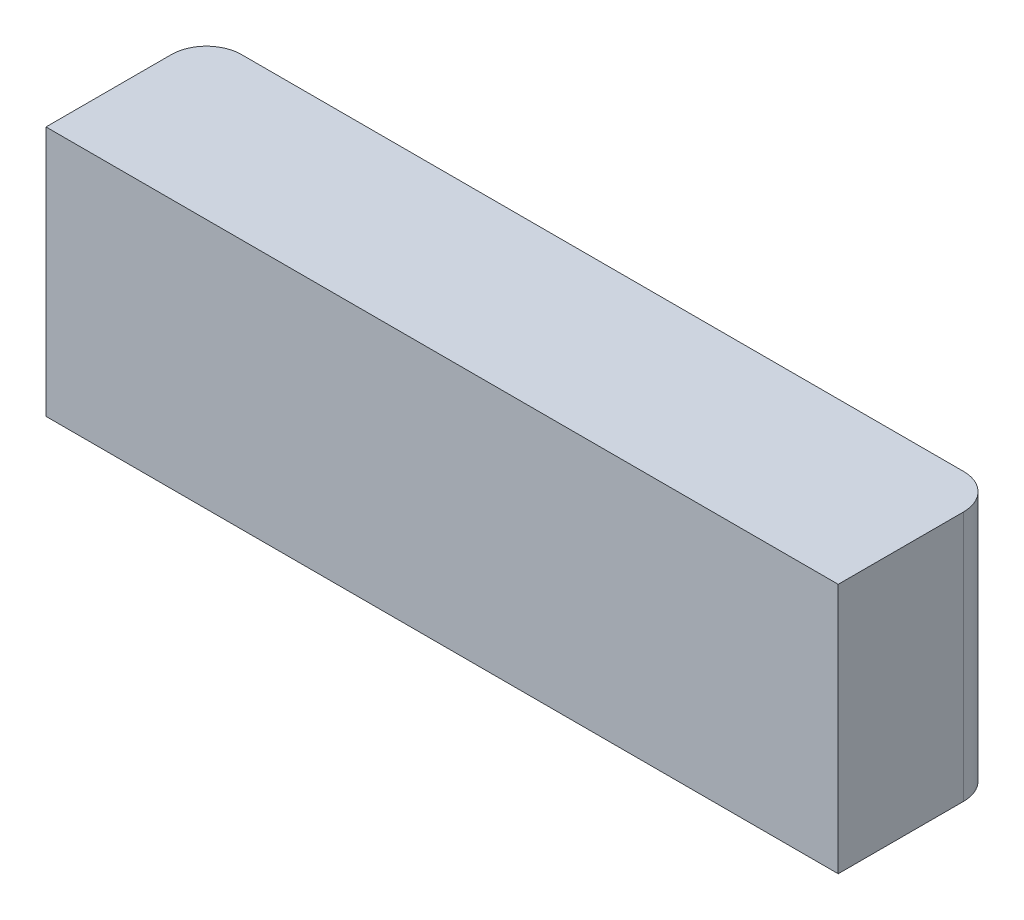
ISO-10303-21;
HEADER;
FILE_DESCRIPTION(('STEP AP214'),'2;1');
FILE_NAME('part.step','',(''),(''),'','','');
FILE_SCHEMA(('AUTOMOTIVE_DESIGN { 1 0 10303 214 1 1 1 1 }'));
ENDSEC;
DATA;
#1=APPLICATION_CONTEXT('core data for automotive mechanical design processes');
#2=APPLICATION_PROTOCOL_DEFINITION('international standard','automotive_design',2000,#1);
#3=PRODUCT_CONTEXT('',#1,'mechanical');
#4=PRODUCT('Part','Part','',(#3));
#5=PRODUCT_RELATED_PRODUCT_CATEGORY('part','',(#4));
#6=PRODUCT_DEFINITION_FORMATION('','',#4);
#7=PRODUCT_DEFINITION_CONTEXT('part definition',#1,'design');
#8=PRODUCT_DEFINITION('design','',#6,#7);
#9=PRODUCT_DEFINITION_SHAPE('','',#8);
#10=(LENGTH_UNIT() NAMED_UNIT(*) SI_UNIT(.MILLI.,.METRE.));
#11=(NAMED_UNIT(*) PLANE_ANGLE_UNIT() SI_UNIT($,.RADIAN.));
#12=(NAMED_UNIT(*) SI_UNIT($,.STERADIAN.) SOLID_ANGLE_UNIT());
#13=UNCERTAINTY_MEASURE_WITH_UNIT(LENGTH_MEASURE(1.E-05),#10,'distance_accuracy_value','');
#14=(GEOMETRIC_REPRESENTATION_CONTEXT(3) GLOBAL_UNCERTAINTY_ASSIGNED_CONTEXT((#13)) GLOBAL_UNIT_ASSIGNED_CONTEXT((#10,
#11,#12)) REPRESENTATION_CONTEXT('',''));
#15=CARTESIAN_POINT('',(0.,0.,0.));
#16=DIRECTION('',(0.,0.,1.));
#17=DIRECTION('',(1.,0.,0.));
#18=AXIS2_PLACEMENT_3D('',#15,#16,#17);
#19=CARTESIAN_POINT('',(118.5,37.5,-13.4999999999999));
#20=DIRECTION('',(-1.,0.,0.));
#21=DIRECTION('',(0.,0.,1.));
#22=AXIS2_PLACEMENT_3D('',#19,#20,#21);
#23=PLANE('',#22);
#24=DIRECTION('',(0.,0.,-1.));
#25=VECTOR('',#24,1.);
#26=CARTESIAN_POINT('',(118.5,-37.5,-13.4999999999999));
#27=LINE('',#26,#25);
#28=CARTESIAN_POINT('',(118.5,-37.5,24.));
#29=VERTEX_POINT('',#28);
#30=CARTESIAN_POINT('',(118.5,-37.5,-13.4999999999999));
#31=VERTEX_POINT('',#30);
#32=EDGE_CURVE('E127',#29,#31,#27,.T.);
#33=ORIENTED_EDGE('',*,*,#32,.T.);
#34=DIRECTION('',(0.,-1.,0.));
#35=VECTOR('',#34,1.);
#36=CARTESIAN_POINT('',(118.5,37.5,-13.4999999999999));
#37=LINE('',#36,#35);
#38=CARTESIAN_POINT('',(118.5,37.5,-13.4999999999999));
#39=VERTEX_POINT('',#38);
#40=EDGE_CURVE('E11',#39,#31,#37,.T.);
#41=ORIENTED_EDGE('',*,*,#40,.F.);
#42=DIRECTION('',(0.,0.,-1.));
#43=VECTOR('',#42,1.);
#44=CARTESIAN_POINT('',(118.5,37.5,-13.4999999999999));
#45=LINE('',#44,#43);
#46=CARTESIAN_POINT('',(118.5,37.5,24.));
#47=VERTEX_POINT('',#46);
#48=EDGE_CURVE('E137',#47,#39,#45,.T.);
#49=ORIENTED_EDGE('',*,*,#48,.F.);
#50=DIRECTION('',(0.,-1.,0.));
#51=VECTOR('',#50,1.);
#52=CARTESIAN_POINT('',(118.5,37.5,24.));
#53=LINE('',#52,#51);
#54=EDGE_CURVE('E123',#47,#29,#53,.T.);
#55=ORIENTED_EDGE('',*,*,#54,.T.);
#56=EDGE_LOOP('',(#33,#41,#49,#55));
#57=FACE_BOUND('',#56,.T.);
#58=ADVANCED_FACE('F43',(#57),#23,.F.);
#59=CARTESIAN_POINT('',(108.,37.5,-13.5));
#60=DIRECTION('',(0.,-1.,0.));
#61=DIRECTION('',(0.,0.,-1.));
#62=AXIS2_PLACEMENT_3D('',#59,#60,#61);
#63=CYLINDRICAL_SURFACE('',#62,10.5);
#64=CARTESIAN_POINT('',(108.,-37.5,-13.5));
#65=DIRECTION('',(0.,1.,0.));
#66=DIRECTION('',(0.,0.,1.));
#67=AXIS2_PLACEMENT_3D('',#64,#65,#66);
#68=CIRCLE('',#67,10.5);
#69=CARTESIAN_POINT('',(108.,-37.5,-24.));
#70=VERTEX_POINT('',#69);
#71=EDGE_CURVE('E130',#31,#70,#68,.T.);
#72=ORIENTED_EDGE('',*,*,#71,.T.);
#73=DIRECTION('',(0.,-1.,0.));
#74=VECTOR('',#73,1.);
#75=CARTESIAN_POINT('',(108.,37.5,-24.));
#76=LINE('',#75,#74);
#77=CARTESIAN_POINT('',(108.,37.5,-24.));
#78=VERTEX_POINT('',#77);
#79=EDGE_CURVE('E51',#78,#70,#76,.T.);
#80=ORIENTED_EDGE('',*,*,#79,.F.);
#81=CARTESIAN_POINT('',(108.,37.5,-13.5));
#82=DIRECTION('',(0.,1.,0.));
#83=DIRECTION('',(0.,0.,1.));
#84=AXIS2_PLACEMENT_3D('',#81,#82,#83);
#85=CIRCLE('',#84,10.5);
#86=EDGE_CURVE('E96',#39,#78,#85,.T.);
#87=ORIENTED_EDGE('',*,*,#86,.F.);
#88=ORIENTED_EDGE('',*,*,#40,.T.);
#89=EDGE_LOOP('',(#72,#80,#87,#88));
#90=FACE_BOUND('',#89,.T.);
#91=ADVANCED_FACE('F161',(#90),#63,.T.);
#92=CARTESIAN_POINT('',(-108.,37.5,-24.));
#93=DIRECTION('',(0.,0.,1.));
#94=DIRECTION('',(1.,0.,0.));
#95=AXIS2_PLACEMENT_3D('',#92,#93,#94);
#96=PLANE('',#95);
#97=DIRECTION('',(-1.,0.,0.));
#98=VECTOR('',#97,1.);
#99=CARTESIAN_POINT('',(-108.,-37.5,-24.));
#100=LINE('',#99,#98);
#101=CARTESIAN_POINT('',(-108.,-37.5,-24.));
#102=VERTEX_POINT('',#101);
#103=EDGE_CURVE('E132',#70,#102,#100,.T.);
#104=ORIENTED_EDGE('',*,*,#103,.T.);
#105=DIRECTION('',(0.,-1.,0.));
#106=VECTOR('',#105,1.);
#107=CARTESIAN_POINT('',(-108.,37.5,-24.));
#108=LINE('',#107,#106);
#109=CARTESIAN_POINT('',(-108.,37.5,-24.));
#110=VERTEX_POINT('',#109);
#111=EDGE_CURVE('E118',#110,#102,#108,.T.);
#112=ORIENTED_EDGE('',*,*,#111,.F.);
#113=DIRECTION('',(-1.,0.,0.));
#114=VECTOR('',#113,1.);
#115=CARTESIAN_POINT('',(-108.,37.5,-24.));
#116=LINE('',#115,#114);
#117=EDGE_CURVE('E109',#78,#110,#116,.T.);
#118=ORIENTED_EDGE('',*,*,#117,.F.);
#119=ORIENTED_EDGE('',*,*,#79,.T.);
#120=EDGE_LOOP('',(#104,#112,#118,#119));
#121=FACE_BOUND('',#120,.T.);
#122=ADVANCED_FACE('F143',(#121),#96,.F.);
#123=CARTESIAN_POINT('',(-108.,37.5,-13.5));
#124=DIRECTION('',(0.,-1.,0.));
#125=DIRECTION('',(0.,0.,-1.));
#126=AXIS2_PLACEMENT_3D('',#123,#124,#125);
#127=CYLINDRICAL_SURFACE('',#126,10.5);
#128=CARTESIAN_POINT('',(-108.,-37.5,-13.5));
#129=DIRECTION('',(0.,1.,0.));
#130=DIRECTION('',(0.,0.,1.));
#131=AXIS2_PLACEMENT_3D('',#128,#129,#130);
#132=CIRCLE('',#131,10.5);
#133=CARTESIAN_POINT('',(-118.5,-37.5,-13.4999999999999));
#134=VERTEX_POINT('',#133);
#135=EDGE_CURVE('E117',#102,#134,#132,.T.);
#136=ORIENTED_EDGE('',*,*,#135,.T.);
#137=DIRECTION('',(0.,-1.,0.));
#138=VECTOR('',#137,1.);
#139=CARTESIAN_POINT('',(-118.5,37.5,-13.4999999999999));
#140=LINE('',#139,#138);
#141=CARTESIAN_POINT('',(-118.5,37.5,-13.4999999999999));
#142=VERTEX_POINT('',#141);
#143=EDGE_CURVE('E114',#142,#134,#140,.T.);
#144=ORIENTED_EDGE('',*,*,#143,.F.);
#145=CARTESIAN_POINT('',(-108.,37.5,-13.5));
#146=DIRECTION('',(0.,1.,0.));
#147=DIRECTION('',(0.,0.,1.));
#148=AXIS2_PLACEMENT_3D('',#145,#146,#147);
#149=CIRCLE('',#148,10.5);
#150=EDGE_CURVE('E103',#110,#142,#149,.T.);
#151=ORIENTED_EDGE('',*,*,#150,.F.);
#152=ORIENTED_EDGE('',*,*,#111,.T.);
#153=EDGE_LOOP('',(#136,#144,#151,#152));
#154=FACE_BOUND('',#153,.T.);
#155=ADVANCED_FACE('F115',(#154),#127,.T.);
#156=CARTESIAN_POINT('',(-118.5,37.5,-13.4999999999999));
#157=DIRECTION('',(1.,0.,0.));
#158=DIRECTION('',(0.,0.,-1.));
#159=AXIS2_PLACEMENT_3D('',#156,#157,#158);
#160=PLANE('',#159);
#161=DIRECTION('',(0.,0.,1.));
#162=VECTOR('',#161,1.);
#163=CARTESIAN_POINT('',(-118.5,-37.5,-13.4999999999999));
#164=LINE('',#163,#162);
#165=CARTESIAN_POINT('',(-118.5,-37.5,24.));
#166=VERTEX_POINT('',#165);
#167=EDGE_CURVE('E82',#134,#166,#164,.T.);
#168=ORIENTED_EDGE('',*,*,#167,.T.);
#169=DIRECTION('',(0.,-1.,0.));
#170=VECTOR('',#169,1.);
#171=CARTESIAN_POINT('',(-118.5,37.5,24.));
#172=LINE('',#171,#170);
#173=CARTESIAN_POINT('',(-118.5,37.5,24.));
#174=VERTEX_POINT('',#173);
#175=EDGE_CURVE('E119',#174,#166,#172,.T.);
#176=ORIENTED_EDGE('',*,*,#175,.F.);
#177=DIRECTION('',(0.,0.,1.));
#178=VECTOR('',#177,1.);
#179=CARTESIAN_POINT('',(-118.5,37.5,-13.4999999999999));
#180=LINE('',#179,#178);
#181=EDGE_CURVE('E107',#142,#174,#180,.T.);
#182=ORIENTED_EDGE('',*,*,#181,.F.);
#183=ORIENTED_EDGE('',*,*,#143,.T.);
#184=EDGE_LOOP('',(#168,#176,#182,#183));
#185=FACE_BOUND('',#184,.T.);
#186=ADVANCED_FACE('F121',(#185),#160,.F.);
#187=CARTESIAN_POINT('',(-118.5,37.5,24.));
#188=DIRECTION('',(0.,0.,-1.));
#189=DIRECTION('',(-1.,0.,0.));
#190=AXIS2_PLACEMENT_3D('',#187,#188,#189);
#191=PLANE('',#190);
#192=DIRECTION('',(1.,0.,0.));
#193=VECTOR('',#192,1.);
#194=CARTESIAN_POINT('',(-118.5,-37.5,24.));
#195=LINE('',#194,#193);
#196=EDGE_CURVE('E88',#166,#29,#195,.T.);
#197=ORIENTED_EDGE('',*,*,#196,.T.);
#198=ORIENTED_EDGE('',*,*,#54,.F.);
#199=DIRECTION('',(1.,0.,0.));
#200=VECTOR('',#199,1.);
#201=CARTESIAN_POINT('',(-118.5,37.5,24.));
#202=LINE('',#201,#200);
#203=EDGE_CURVE('E59',#174,#47,#202,.T.);
#204=ORIENTED_EDGE('',*,*,#203,.F.);
#205=ORIENTED_EDGE('',*,*,#175,.T.);
#206=EDGE_LOOP('',(#197,#198,#204,#205));
#207=FACE_BOUND('',#206,.T.);
#208=ADVANCED_FACE('F150',(#207),#191,.F.);
#209=CARTESIAN_POINT('',(-108.,37.5,-13.5));
#210=DIRECTION('',(0.,1.,0.));
#211=DIRECTION('',(0.,0.,1.));
#212=AXIS2_PLACEMENT_3D('',#209,#210,#211);
#213=PLANE('',#212);
#214=ORIENTED_EDGE('',*,*,#48,.T.);
#215=ORIENTED_EDGE('',*,*,#86,.T.);
#216=ORIENTED_EDGE('',*,*,#117,.T.);
#217=ORIENTED_EDGE('',*,*,#150,.T.);
#218=ORIENTED_EDGE('',*,*,#181,.T.);
#219=ORIENTED_EDGE('',*,*,#203,.T.);
#220=EDGE_LOOP('',(#214,#215,#216,#217,#218,#219));
#221=FACE_BOUND('',#220,.T.);
#222=ADVANCED_FACE('F105',(#221),#213,.T.);
#223=CARTESIAN_POINT('',(-108.,-37.5,-13.5));
#224=DIRECTION('',(0.,1.,0.));
#225=DIRECTION('',(0.,0.,1.));
#226=AXIS2_PLACEMENT_3D('',#223,#224,#225);
#227=PLANE('',#226);
#228=ORIENTED_EDGE('',*,*,#32,.F.);
#229=ORIENTED_EDGE('',*,*,#196,.F.);
#230=ORIENTED_EDGE('',*,*,#167,.F.);
#231=ORIENTED_EDGE('',*,*,#135,.F.);
#232=ORIENTED_EDGE('',*,*,#103,.F.);
#233=ORIENTED_EDGE('',*,*,#71,.F.);
#234=EDGE_LOOP('',(#228,#229,#230,#231,#232,#233));
#235=FACE_BOUND('',#234,.T.);
#236=ADVANCED_FACE('F146',(#235),#227,.F.);
#237=CLOSED_SHELL('',(#58,#91,#122,#155,#186,#208,#222,#236));
#238=MANIFOLD_SOLID_BREP('B2',#237);
#239=ADVANCED_BREP_SHAPE_REPRESENTATION('',(#18,#238),#14);
#240=SHAPE_DEFINITION_REPRESENTATION(#9,#239);
ENDSEC;
END-ISO-10303-21;
